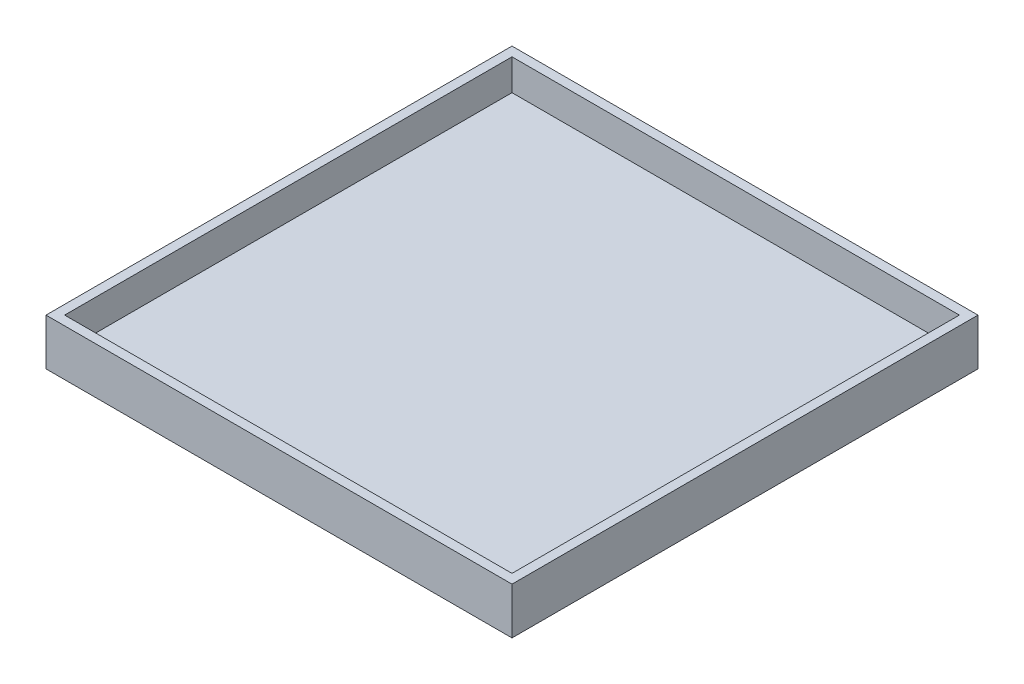
ISO-10303-21;
HEADER;
FILE_DESCRIPTION(('STEP AP214'),'2;1');
FILE_NAME('part.step','',(''),(''),'','','');
FILE_SCHEMA(('AUTOMOTIVE_DESIGN { 1 0 10303 214 1 1 1 1 }'));
ENDSEC;
DATA;
#1=APPLICATION_CONTEXT('core data for automotive mechanical design processes');
#2=APPLICATION_PROTOCOL_DEFINITION('international standard','automotive_design',2000,#1);
#3=PRODUCT_CONTEXT('',#1,'mechanical');
#4=PRODUCT('Part','Part','',(#3));
#5=PRODUCT_RELATED_PRODUCT_CATEGORY('part','',(#4));
#6=PRODUCT_DEFINITION_FORMATION('','',#4);
#7=PRODUCT_DEFINITION_CONTEXT('part definition',#1,'design');
#8=PRODUCT_DEFINITION('design','',#6,#7);
#9=PRODUCT_DEFINITION_SHAPE('','',#8);
#10=(LENGTH_UNIT() NAMED_UNIT(*) SI_UNIT(.MILLI.,.METRE.));
#11=(NAMED_UNIT(*) PLANE_ANGLE_UNIT() SI_UNIT($,.RADIAN.));
#12=(NAMED_UNIT(*) SI_UNIT($,.STERADIAN.) SOLID_ANGLE_UNIT());
#13=UNCERTAINTY_MEASURE_WITH_UNIT(LENGTH_MEASURE(1.E-05),#10,'distance_accuracy_value','');
#14=(GEOMETRIC_REPRESENTATION_CONTEXT(3) GLOBAL_UNCERTAINTY_ASSIGNED_CONTEXT((#13)) GLOBAL_UNIT_ASSIGNED_CONTEXT((#10,
#11,#12)) REPRESENTATION_CONTEXT('',''));
#15=CARTESIAN_POINT('',(0.,0.,0.));
#16=DIRECTION('',(0.,0.,1.));
#17=DIRECTION('',(1.,0.,0.));
#18=AXIS2_PLACEMENT_3D('',#15,#16,#17);
#19=CARTESIAN_POINT('',(75.,15.,75.));
#20=DIRECTION('',(-1.,0.,0.));
#21=DIRECTION('',(0.,0.,1.));
#22=AXIS2_PLACEMENT_3D('',#19,#20,#21);
#23=PLANE('',#22);
#24=DIRECTION('',(0.,0.,-1.));
#25=VECTOR('',#24,1.);
#26=CARTESIAN_POINT('',(75.,0.,75.));
#27=LINE('',#26,#25);
#28=CARTESIAN_POINT('',(75.,0.,75.));
#29=VERTEX_POINT('',#28);
#30=CARTESIAN_POINT('',(75.,0.,-75.));
#31=VERTEX_POINT('',#30);
#32=EDGE_CURVE('E158',#29,#31,#27,.T.);
#33=ORIENTED_EDGE('',*,*,#32,.T.);
#34=DIRECTION('',(0.,-1.,0.));
#35=VECTOR('',#34,1.);
#36=CARTESIAN_POINT('',(75.,15.,-75.));
#37=LINE('',#36,#35);
#38=CARTESIAN_POINT('',(75.,15.,-75.));
#39=VERTEX_POINT('',#38);
#40=EDGE_CURVE('E11',#39,#31,#37,.T.);
#41=ORIENTED_EDGE('',*,*,#40,.F.);
#42=DIRECTION('',(0.,0.,-1.));
#43=VECTOR('',#42,1.);
#44=CARTESIAN_POINT('',(75.,15.,75.));
#45=LINE('',#44,#43);
#46=CARTESIAN_POINT('',(75.,15.,75.));
#47=VERTEX_POINT('',#46);
#48=EDGE_CURVE('E164',#47,#39,#45,.T.);
#49=ORIENTED_EDGE('',*,*,#48,.F.);
#50=DIRECTION('',(0.,-1.,0.));
#51=VECTOR('',#50,1.);
#52=CARTESIAN_POINT('',(75.,15.,75.));
#53=LINE('',#52,#51);
#54=EDGE_CURVE('E174',#47,#29,#53,.T.);
#55=ORIENTED_EDGE('',*,*,#54,.T.);
#56=EDGE_LOOP('',(#33,#41,#49,#55));
#57=FACE_BOUND('',#56,.T.);
#58=ADVANCED_FACE('F39',(#57),#23,.F.);
#59=CARTESIAN_POINT('',(-75.,15.,-75.));
#60=DIRECTION('',(0.,0.,1.));
#61=DIRECTION('',(1.,0.,0.));
#62=AXIS2_PLACEMENT_3D('',#59,#60,#61);
#63=PLANE('',#62);
#64=DIRECTION('',(-1.,0.,0.));
#65=VECTOR('',#64,1.);
#66=CARTESIAN_POINT('',(-75.,0.,-75.));
#67=LINE('',#66,#65);
#68=CARTESIAN_POINT('',(-75.,0.,-75.));
#69=VERTEX_POINT('',#68);
#70=EDGE_CURVE('E178',#31,#69,#67,.T.);
#71=ORIENTED_EDGE('',*,*,#70,.T.);
#72=DIRECTION('',(0.,-1.,0.));
#73=VECTOR('',#72,1.);
#74=CARTESIAN_POINT('',(-75.,15.,-75.));
#75=LINE('',#74,#73);
#76=CARTESIAN_POINT('',(-75.,15.,-75.));
#77=VERTEX_POINT('',#76);
#78=EDGE_CURVE('E47',#77,#69,#75,.T.);
#79=ORIENTED_EDGE('',*,*,#78,.F.);
#80=DIRECTION('',(-1.,0.,0.));
#81=VECTOR('',#80,1.);
#82=CARTESIAN_POINT('',(-75.,15.,-75.));
#83=LINE('',#82,#81);
#84=EDGE_CURVE('E91',#39,#77,#83,.T.);
#85=ORIENTED_EDGE('',*,*,#84,.F.);
#86=ORIENTED_EDGE('',*,*,#40,.T.);
#87=EDGE_LOOP('',(#71,#79,#85,#86));
#88=FACE_BOUND('',#87,.T.);
#89=ADVANCED_FACE('F213',(#88),#63,.F.);
#90=CARTESIAN_POINT('',(-75.,15.,75.));
#91=DIRECTION('',(1.,0.,0.));
#92=DIRECTION('',(0.,0.,-1.));
#93=AXIS2_PLACEMENT_3D('',#90,#91,#92);
#94=PLANE('',#93);
#95=DIRECTION('',(0.,0.,1.));
#96=VECTOR('',#95,1.);
#97=CARTESIAN_POINT('',(-75.,0.,75.));
#98=LINE('',#97,#96);
#99=CARTESIAN_POINT('',(-75.,0.,75.));
#100=VERTEX_POINT('',#99);
#101=EDGE_CURVE('E181',#69,#100,#98,.T.);
#102=ORIENTED_EDGE('',*,*,#101,.T.);
#103=DIRECTION('',(0.,-1.,0.));
#104=VECTOR('',#103,1.);
#105=CARTESIAN_POINT('',(-75.,15.,75.));
#106=LINE('',#105,#104);
#107=CARTESIAN_POINT('',(-75.,15.,75.));
#108=VERTEX_POINT('',#107);
#109=EDGE_CURVE('E188',#108,#100,#106,.T.);
#110=ORIENTED_EDGE('',*,*,#109,.F.);
#111=DIRECTION('',(0.,0.,1.));
#112=VECTOR('',#111,1.);
#113=CARTESIAN_POINT('',(-75.,15.,75.));
#114=LINE('',#113,#112);
#115=EDGE_CURVE('E169',#77,#108,#114,.T.);
#116=ORIENTED_EDGE('',*,*,#115,.F.);
#117=ORIENTED_EDGE('',*,*,#78,.T.);
#118=EDGE_LOOP('',(#102,#110,#116,#117));
#119=FACE_BOUND('',#118,.T.);
#120=ADVANCED_FACE('F195',(#119),#94,.F.);
#121=CARTESIAN_POINT('',(-75.,15.,75.));
#122=DIRECTION('',(0.,0.,-1.));
#123=DIRECTION('',(-1.,0.,0.));
#124=AXIS2_PLACEMENT_3D('',#121,#122,#123);
#125=PLANE('',#124);
#126=DIRECTION('',(1.,0.,0.));
#127=VECTOR('',#126,1.);
#128=CARTESIAN_POINT('',(-75.,0.,75.));
#129=LINE('',#128,#127);
#130=EDGE_CURVE('E84',#100,#29,#129,.T.);
#131=ORIENTED_EDGE('',*,*,#130,.T.);
#132=ORIENTED_EDGE('',*,*,#54,.F.);
#133=DIRECTION('',(1.,0.,0.));
#134=VECTOR('',#133,1.);
#135=CARTESIAN_POINT('',(-75.,15.,75.));
#136=LINE('',#135,#134);
#137=EDGE_CURVE('E63',#108,#47,#136,.T.);
#138=ORIENTED_EDGE('',*,*,#137,.F.);
#139=ORIENTED_EDGE('',*,*,#109,.T.);
#140=EDGE_LOOP('',(#131,#132,#138,#139));
#141=FACE_BOUND('',#140,.T.);
#142=ADVANCED_FACE('F203',(#141),#125,.F.);
#143=CARTESIAN_POINT('',(0.,15.,0.));
#144=DIRECTION('',(0.,-1.,0.));
#145=DIRECTION('',(0.,0.,-1.));
#146=AXIS2_PLACEMENT_3D('',#143,#144,#145);
#147=PLANE('',#146);
#148=DIRECTION('',(0.,0.,1.));
#149=VECTOR('',#148,1.);
#150=CARTESIAN_POINT('',(-72.,15.,-72.));
#151=LINE('',#150,#149);
#152=CARTESIAN_POINT('',(-72.,15.,-72.));
#153=VERTEX_POINT('',#152);
#154=CARTESIAN_POINT('',(-72.,15.,72.));
#155=VERTEX_POINT('',#154);
#156=EDGE_CURVE('E149',#153,#155,#151,.T.);
#157=ORIENTED_EDGE('',*,*,#156,.F.);
#158=DIRECTION('',(-1.,0.,0.));
#159=VECTOR('',#158,1.);
#160=CARTESIAN_POINT('',(-72.,15.,-72.));
#161=LINE('',#160,#159);
#162=CARTESIAN_POINT('',(72.,15.,-72.));
#163=VERTEX_POINT('',#162);
#164=EDGE_CURVE('E54',#163,#153,#161,.T.);
#165=ORIENTED_EDGE('',*,*,#164,.F.);
#166=DIRECTION('',(0.,0.,-1.));
#167=VECTOR('',#166,1.);
#168=CARTESIAN_POINT('',(72.,15.,-72.));
#169=LINE('',#168,#167);
#170=CARTESIAN_POINT('',(72.,15.,72.));
#171=VERTEX_POINT('',#170);
#172=EDGE_CURVE('E136',#171,#163,#169,.T.);
#173=ORIENTED_EDGE('',*,*,#172,.F.);
#174=DIRECTION('',(1.,0.,0.));
#175=VECTOR('',#174,1.);
#176=CARTESIAN_POINT('',(72.,15.,72.));
#177=LINE('',#176,#175);
#178=EDGE_CURVE('E140',#155,#171,#177,.T.);
#179=ORIENTED_EDGE('',*,*,#178,.F.);
#180=EDGE_LOOP('',(#157,#165,#173,#179));
#181=FACE_BOUND('',#180,.T.);
#182=ORIENTED_EDGE('',*,*,#48,.T.);
#183=ORIENTED_EDGE('',*,*,#84,.T.);
#184=ORIENTED_EDGE('',*,*,#115,.T.);
#185=ORIENTED_EDGE('',*,*,#137,.T.);
#186=EDGE_LOOP('',(#182,#183,#184,#185));
#187=FACE_BOUND('',#186,.T.);
#188=ADVANCED_FACE('F205',(#181,#187),#147,.F.);
#189=CARTESIAN_POINT('',(0.,0.,0.));
#190=DIRECTION('',(0.,-1.,0.));
#191=DIRECTION('',(0.,0.,-1.));
#192=AXIS2_PLACEMENT_3D('',#189,#190,#191);
#193=PLANE('',#192);
#194=ORIENTED_EDGE('',*,*,#32,.F.);
#195=ORIENTED_EDGE('',*,*,#130,.F.);
#196=ORIENTED_EDGE('',*,*,#101,.F.);
#197=ORIENTED_EDGE('',*,*,#70,.F.);
#198=EDGE_LOOP('',(#194,#195,#196,#197));
#199=FACE_BOUND('',#198,.T.);
#200=ADVANCED_FACE('F199',(#199),#193,.T.);
#201=CARTESIAN_POINT('',(-72.,5.,-72.));
#202=DIRECTION('',(0.,0.,-1.));
#203=DIRECTION('',(-1.,0.,0.));
#204=AXIS2_PLACEMENT_3D('',#201,#202,#203);
#205=PLANE('',#204);
#206=ORIENTED_EDGE('',*,*,#164,.T.);
#207=DIRECTION('',(0.,1.,0.));
#208=VECTOR('',#207,1.);
#209=CARTESIAN_POINT('',(-72.,5.,-72.));
#210=LINE('',#209,#208);
#211=CARTESIAN_POINT('',(-72.,5.,-72.));
#212=VERTEX_POINT('',#211);
#213=EDGE_CURVE('E111',#212,#153,#210,.T.);
#214=ORIENTED_EDGE('',*,*,#213,.F.);
#215=DIRECTION('',(-1.,0.,0.));
#216=VECTOR('',#215,1.);
#217=CARTESIAN_POINT('',(-72.,5.,-72.));
#218=LINE('',#217,#216);
#219=CARTESIAN_POINT('',(72.,5.,-72.));
#220=VERTEX_POINT('',#219);
#221=EDGE_CURVE('E115',#220,#212,#218,.T.);
#222=ORIENTED_EDGE('',*,*,#221,.F.);
#223=DIRECTION('',(0.,1.,0.));
#224=VECTOR('',#223,1.);
#225=CARTESIAN_POINT('',(72.,5.,-72.));
#226=LINE('',#225,#224);
#227=EDGE_CURVE('E155',#220,#163,#226,.T.);
#228=ORIENTED_EDGE('',*,*,#227,.T.);
#229=EDGE_LOOP('',(#206,#214,#222,#228));
#230=FACE_BOUND('',#229,.T.);
#231=ADVANCED_FACE('F113',(#230),#205,.F.);
#232=CARTESIAN_POINT('',(72.,5.,-72.));
#233=DIRECTION('',(1.,0.,0.));
#234=DIRECTION('',(0.,0.,-1.));
#235=AXIS2_PLACEMENT_3D('',#232,#233,#234);
#236=PLANE('',#235);
#237=ORIENTED_EDGE('',*,*,#172,.T.);
#238=ORIENTED_EDGE('',*,*,#227,.F.);
#239=DIRECTION('',(0.,0.,-1.));
#240=VECTOR('',#239,1.);
#241=CARTESIAN_POINT('',(72.,5.,-72.));
#242=LINE('',#241,#240);
#243=CARTESIAN_POINT('',(72.,5.,72.));
#244=VERTEX_POINT('',#243);
#245=EDGE_CURVE('E122',#244,#220,#242,.T.);
#246=ORIENTED_EDGE('',*,*,#245,.F.);
#247=DIRECTION('',(0.,1.,0.));
#248=VECTOR('',#247,1.);
#249=CARTESIAN_POINT('',(72.,5.,72.));
#250=LINE('',#249,#248);
#251=EDGE_CURVE('E159',#244,#171,#250,.T.);
#252=ORIENTED_EDGE('',*,*,#251,.T.);
#253=EDGE_LOOP('',(#237,#238,#246,#252));
#254=FACE_BOUND('',#253,.T.);
#255=ADVANCED_FACE('F252',(#254),#236,.F.);
#256=CARTESIAN_POINT('',(72.,5.,72.));
#257=DIRECTION('',(0.,0.,1.));
#258=DIRECTION('',(1.,0.,0.));
#259=AXIS2_PLACEMENT_3D('',#256,#257,#258);
#260=PLANE('',#259);
#261=ORIENTED_EDGE('',*,*,#178,.T.);
#262=ORIENTED_EDGE('',*,*,#251,.F.);
#263=DIRECTION('',(1.,0.,0.));
#264=VECTOR('',#263,1.);
#265=CARTESIAN_POINT('',(72.,5.,72.));
#266=LINE('',#265,#264);
#267=CARTESIAN_POINT('',(-72.,5.,72.));
#268=VERTEX_POINT('',#267);
#269=EDGE_CURVE('E131',#268,#244,#266,.T.);
#270=ORIENTED_EDGE('',*,*,#269,.F.);
#271=DIRECTION('',(0.,1.,0.));
#272=VECTOR('',#271,1.);
#273=CARTESIAN_POINT('',(-72.,5.,72.));
#274=LINE('',#273,#272);
#275=EDGE_CURVE('E121',#268,#155,#274,.T.);
#276=ORIENTED_EDGE('',*,*,#275,.T.);
#277=EDGE_LOOP('',(#261,#262,#270,#276));
#278=FACE_BOUND('',#277,.T.);
#279=ADVANCED_FACE('F261',(#278),#260,.F.);
#280=CARTESIAN_POINT('',(-72.,5.,-72.));
#281=DIRECTION('',(-1.,0.,0.));
#282=DIRECTION('',(0.,0.,1.));
#283=AXIS2_PLACEMENT_3D('',#280,#281,#282);
#284=PLANE('',#283);
#285=ORIENTED_EDGE('',*,*,#156,.T.);
#286=ORIENTED_EDGE('',*,*,#275,.F.);
#287=DIRECTION('',(0.,0.,1.));
#288=VECTOR('',#287,1.);
#289=CARTESIAN_POINT('',(-72.,5.,-72.));
#290=LINE('',#289,#288);
#291=EDGE_CURVE('E125',#212,#268,#290,.T.);
#292=ORIENTED_EDGE('',*,*,#291,.F.);
#293=ORIENTED_EDGE('',*,*,#213,.T.);
#294=EDGE_LOOP('',(#285,#286,#292,#293));
#295=FACE_BOUND('',#294,.T.);
#296=ADVANCED_FACE('F126',(#295),#284,.F.);
#297=CARTESIAN_POINT('',(0.,5.,0.));
#298=DIRECTION('',(0.,-1.,0.));
#299=DIRECTION('',(0.,0.,-1.));
#300=AXIS2_PLACEMENT_3D('',#297,#298,#299);
#301=PLANE('',#300);
#302=ORIENTED_EDGE('',*,*,#221,.T.);
#303=ORIENTED_EDGE('',*,*,#291,.T.);
#304=ORIENTED_EDGE('',*,*,#269,.T.);
#305=ORIENTED_EDGE('',*,*,#245,.T.);
#306=EDGE_LOOP('',(#302,#303,#304,#305));
#307=FACE_BOUND('',#306,.T.);
#308=ADVANCED_FACE('F133',(#307),#301,.F.);
#309=CLOSED_SHELL('',(#58,#89,#120,#142,#188,#200,#231,#255,#279,#296,#308));
#310=MANIFOLD_SOLID_BREP('B2',#309);
#311=ADVANCED_BREP_SHAPE_REPRESENTATION('',(#18,#310),#14);
#312=SHAPE_DEFINITION_REPRESENTATION(#9,#311);
ENDSEC;
END-ISO-10303-21;
